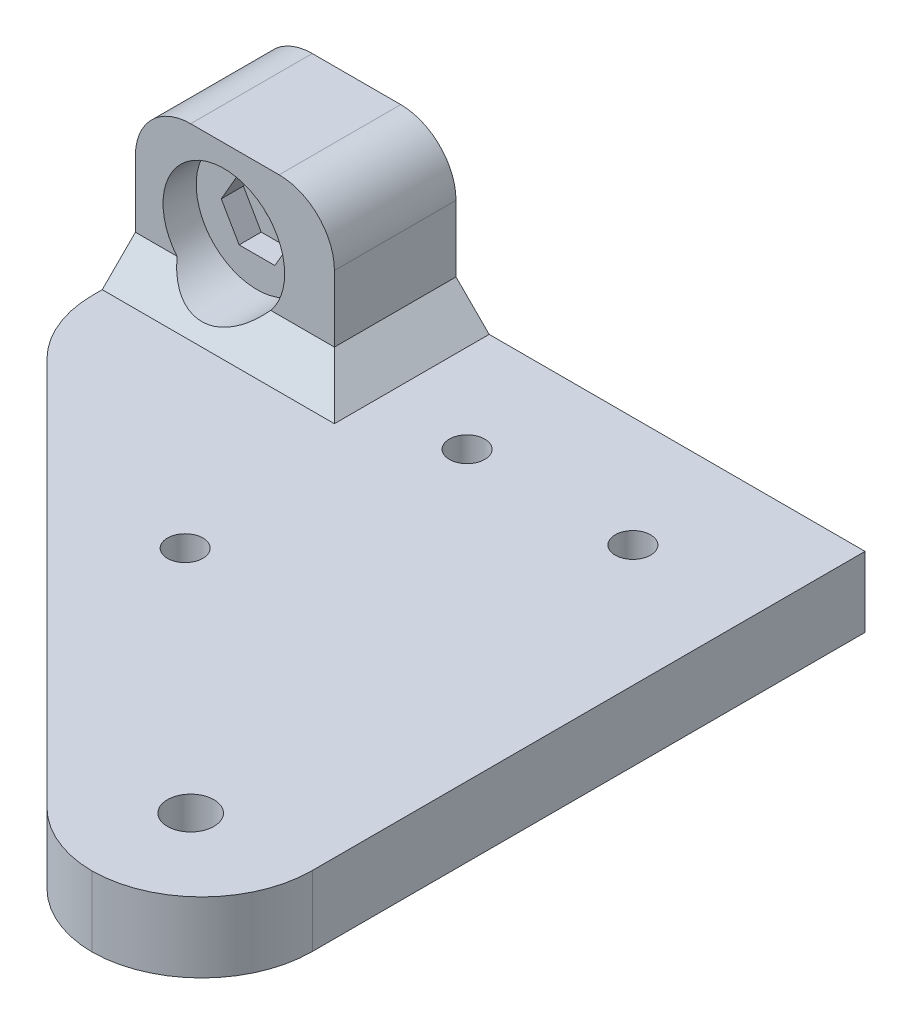
ISO-10303-21;
HEADER;
FILE_DESCRIPTION(('STEP AP214'),'2;1');
FILE_NAME('part.step','',(''),(''),'','','');
FILE_SCHEMA(('AUTOMOTIVE_DESIGN { 1 0 10303 214 1 1 1 1 }'));
ENDSEC;
DATA;
#1=APPLICATION_CONTEXT('core data for automotive mechanical design processes');
#2=APPLICATION_PROTOCOL_DEFINITION('international standard','automotive_design',2000,#1);
#3=PRODUCT_CONTEXT('',#1,'mechanical');
#4=PRODUCT('Part','Part','',(#3));
#5=PRODUCT_RELATED_PRODUCT_CATEGORY('part','',(#4));
#6=PRODUCT_DEFINITION_FORMATION('','',#4);
#7=PRODUCT_DEFINITION_CONTEXT('part definition',#1,'design');
#8=PRODUCT_DEFINITION('design','',#6,#7);
#9=PRODUCT_DEFINITION_SHAPE('','',#8);
#10=(LENGTH_UNIT() NAMED_UNIT(*) SI_UNIT(.MILLI.,.METRE.));
#11=(NAMED_UNIT(*) PLANE_ANGLE_UNIT() SI_UNIT($,.RADIAN.));
#12=(NAMED_UNIT(*) SI_UNIT($,.STERADIAN.) SOLID_ANGLE_UNIT());
#13=UNCERTAINTY_MEASURE_WITH_UNIT(LENGTH_MEASURE(1.E-05),#10,'distance_accuracy_value','');
#14=(GEOMETRIC_REPRESENTATION_CONTEXT(3) GLOBAL_UNCERTAINTY_ASSIGNED_CONTEXT((#13)) GLOBAL_UNIT_ASSIGNED_CONTEXT((#10,
#11,#12)) REPRESENTATION_CONTEXT('',''));
#15=CARTESIAN_POINT('',(0.,0.,0.));
#16=DIRECTION('',(0.,0.,1.));
#17=DIRECTION('',(1.,0.,0.));
#18=AXIS2_PLACEMENT_3D('',#15,#16,#17);
#19=CARTESIAN_POINT('',(-47.,-2623.18047378745,-60.));
#20=DIRECTION('',(0.,0.,1.));
#21=DIRECTION('',(1.,0.,0.));
#22=AXIS2_PLACEMENT_3D('',#19,#20,#21);
#23=CYLINDRICAL_SURFACE('',#22,1.59999999999963);
#24=CARTESIAN_POINT('',(-47.,-2623.18047378745,-54.));
#25=DIRECTION('',(0.,0.,1.));
#26=DIRECTION('',(1.,0.,0.));
#27=AXIS2_PLACEMENT_3D('',#24,#25,#26);
#28=CIRCLE('',#27,1.59999999999963);
#29=CARTESIAN_POINT('',(-45.4000000000004,-2623.18047378745,-54.));
#30=VERTEX_POINT('',#29);
#31=EDGE_CURVE('E203',#30,#30,#28,.T.);
#32=ORIENTED_EDGE('',*,*,#31,.T.);
#33=EDGE_LOOP('',(#32));
#34=FACE_BOUND('',#33,.T.);
#35=CARTESIAN_POINT('',(-47.,-2623.18047378745,-57.));
#36=DIRECTION('',(0.,0.,-1.));
#37=DIRECTION('',(-1.,0.,0.));
#38=AXIS2_PLACEMENT_3D('',#35,#36,#37);
#39=CIRCLE('',#38,1.59999999999963);
#40=CARTESIAN_POINT('',(-48.5999999999996,-2623.18047378745,-57.));
#41=VERTEX_POINT('',#40);
#42=EDGE_CURVE('E39',#41,#41,#39,.F.);
#43=ORIENTED_EDGE('',*,*,#42,.F.);
#44=EDGE_LOOP('',(#43));
#45=FACE_BOUND('',#44,.T.);
#46=ADVANCED_FACE('F35',(#34,#45),#23,.F.);
#47=CARTESIAN_POINT('',(0.,-2629.68047378745,0.));
#48=DIRECTION('',(0.,1.,0.));
#49=DIRECTION('',(0.,0.,1.));
#50=AXIS2_PLACEMENT_3D('',#47,#48,#49);
#51=PLANE('',#50);
#52=CARTESIAN_POINT('',(-26.,-2629.68047378745,-50.));
#53=DIRECTION('',(0.,1.,0.));
#54=DIRECTION('',(0.,0.,1.));
#55=AXIS2_PLACEMENT_3D('',#52,#53,#54);
#56=CIRCLE('',#55,1.59999999999996);
#57=CARTESIAN_POINT('',(-26.,-2629.68047378745,-48.4));
#58=VERTEX_POINT('',#57);
#59=EDGE_CURVE('E251',#58,#58,#56,.T.);
#60=ORIENTED_EDGE('',*,*,#59,.F.);
#61=EDGE_LOOP('',(#60));
#62=FACE_BOUND('',#61,.T.);
#63=CARTESIAN_POINT('',(-31.,-2629.68047378745,-29.5));
#64=DIRECTION('',(0.,1.,0.));
#65=DIRECTION('',(0.,0.,1.));
#66=AXIS2_PLACEMENT_3D('',#63,#64,#65);
#67=CIRCLE('',#66,1.59999999999996);
#68=CARTESIAN_POINT('',(-31.,-2629.68047378745,-27.9));
#69=VERTEX_POINT('',#68);
#70=EDGE_CURVE('E264',#69,#69,#67,.T.);
#71=ORIENTED_EDGE('',*,*,#70,.F.);
#72=EDGE_LOOP('',(#71));
#73=FACE_BOUND('',#72,.T.);
#74=CARTESIAN_POINT('',(-10.,-2629.68047378745,-9.));
#75=DIRECTION('',(0.,1.,0.));
#76=DIRECTION('',(0.,0.,1.));
#77=AXIS2_PLACEMENT_3D('',#74,#75,#76);
#78=CIRCLE('',#77,2.09999999999999);
#79=CARTESIAN_POINT('',(-10.,-2629.68047378745,-6.90000000000001));
#80=VERTEX_POINT('',#79);
#81=EDGE_CURVE('E270',#80,#80,#78,.T.);
#82=ORIENTED_EDGE('',*,*,#81,.F.);
#83=EDGE_LOOP('',(#82));
#84=FACE_BOUND('',#83,.T.);
#85=CARTESIAN_POINT('',(-11.,-2629.68047378745,-50.));
#86=DIRECTION('',(0.,1.,0.));
#87=DIRECTION('',(0.,0.,1.));
#88=AXIS2_PLACEMENT_3D('',#85,#86,#87);
#89=CIRCLE('',#88,1.59999999999996);
#90=CARTESIAN_POINT('',(-11.,-2629.68047378745,-48.4));
#91=VERTEX_POINT('',#90);
#92=EDGE_CURVE('E258',#91,#91,#89,.T.);
#93=ORIENTED_EDGE('',*,*,#92,.F.);
#94=EDGE_LOOP('',(#93));
#95=FACE_BOUND('',#94,.T.);
#96=DIRECTION('',(0.,0.,1.));
#97=VECTOR('',#96,1.);
#98=CARTESIAN_POINT('',(-55.,-2629.68047378745,-60.));
#99=LINE('',#98,#97);
#100=CARTESIAN_POINT('',(-55.,-2629.68047378745,-45.9999999999999));
#101=VERTEX_POINT('',#100);
#102=CARTESIAN_POINT('',(-55.,-2629.68047378745,-45.142135623731));
#103=VERTEX_POINT('',#102);
#104=EDGE_CURVE('E288',#101,#103,#99,.T.);
#105=ORIENTED_EDGE('',*,*,#104,.T.);
#106=CARTESIAN_POINT('',(-45.,-2629.68047378745,-45.142135623731));
#107=DIRECTION('',(0.,1.,0.));
#108=DIRECTION('',(0.,0.,1.));
#109=AXIS2_PLACEMENT_3D('',#106,#107,#108);
#110=CIRCLE('',#109,10.);
#111=CARTESIAN_POINT('',(-52.0710678118654,-2629.68047378745,-38.0710678118655));
#112=VERTEX_POINT('',#111);
#113=EDGE_CURVE('E333',#103,#112,#110,.T.);
#114=ORIENTED_EDGE('',*,*,#113,.T.);
#115=DIRECTION('',(0.707106781186552,0.,0.707106781186543));
#116=VECTOR('',#115,1.);
#117=CARTESIAN_POINT('',(-55.,-2629.68047378745,-41.));
#118=LINE('',#117,#116);
#119=CARTESIAN_POINT('',(-16.928932188134,-2629.68047378745,-2.92893218813449));
#120=VERTEX_POINT('',#119);
#121=EDGE_CURVE('E371',#112,#120,#118,.T.);
#122=ORIENTED_EDGE('',*,*,#121,.T.);
#123=CARTESIAN_POINT('',(-9.85786437626859,-2629.68047378745,-10.));
#124=DIRECTION('',(0.,1.,0.));
#125=DIRECTION('',(0.,0.,1.));
#126=AXIS2_PLACEMENT_3D('',#123,#124,#125);
#127=CIRCLE('',#126,10.);
#128=CARTESIAN_POINT('',(-9.9289321881343,-2629.68047378745,-0.000252534882861158));
#129=VERTEX_POINT('',#128);
#130=EDGE_CURVE('E364',#120,#129,#127,.T.);
#131=ORIENTED_EDGE('',*,*,#130,.T.);
#132=CARTESIAN_POINT('',(-10.,-2629.68047378745,-10.));
#133=DIRECTION('',(0.,1.,0.));
#134=DIRECTION('',(0.,0.,1.));
#135=AXIS2_PLACEMENT_3D('',#132,#133,#134);
#136=CIRCLE('',#135,10.);
#137=CARTESIAN_POINT('',(0.,-2629.68047378745,-10.));
#138=VERTEX_POINT('',#137);
#139=EDGE_CURVE('E362',#129,#138,#136,.T.);
#140=ORIENTED_EDGE('',*,*,#139,.T.);
#141=DIRECTION('',(0.,0.,-1.));
#142=VECTOR('',#141,1.);
#143=CARTESIAN_POINT('',(0.,-2629.68047378745,0.));
#144=LINE('',#143,#142);
#145=CARTESIAN_POINT('',(0.,-2629.68047378745,-60.));
#146=VERTEX_POINT('',#145);
#147=EDGE_CURVE('E276',#138,#146,#144,.T.);
#148=ORIENTED_EDGE('',*,*,#147,.T.);
#149=DIRECTION('',(-1.,0.,0.));
#150=VECTOR('',#149,1.);
#151=CARTESIAN_POINT('',(0.,-2629.68047378745,-60.));
#152=LINE('',#151,#150);
#153=CARTESIAN_POINT('',(-33.9999999999999,-2629.68047378745,-60.));
#154=VERTEX_POINT('',#153);
#155=EDGE_CURVE('E278',#146,#154,#152,.T.);
#156=ORIENTED_EDGE('',*,*,#155,.T.);
#157=DIRECTION('',(0.,0.,1.));
#158=VECTOR('',#157,1.);
#159=CARTESIAN_POINT('',(-33.9999999999999,-2629.68047378745,-49.));
#160=LINE('',#159,#158);
#161=CARTESIAN_POINT('',(-33.9999999999999,-2629.68047378745,-45.9999999999999));
#162=VERTEX_POINT('',#161);
#163=EDGE_CURVE('E404',#154,#162,#160,.T.);
#164=ORIENTED_EDGE('',*,*,#163,.T.);
#165=DIRECTION('',(-1.,0.,0.));
#166=VECTOR('',#165,1.);
#167=CARTESIAN_POINT('',(-55.,-2629.68047378745,-45.9999999999999));
#168=LINE('',#167,#166);
#169=EDGE_CURVE('E401',#162,#101,#168,.T.);
#170=ORIENTED_EDGE('',*,*,#169,.T.);
#171=EDGE_LOOP('',(#105,#114,#122,#131,#140,#148,#156,#164,#170));
#172=FACE_BOUND('',#171,.T.);
#173=ADVANCED_FACE('F370',(#62,#73,#84,#95,#172),#51,.T.);
#174=CARTESIAN_POINT('',(0.,-2636.03047378745,0.));
#175=DIRECTION('',(0.,1.,0.));
#176=DIRECTION('',(0.,0.,1.));
#177=AXIS2_PLACEMENT_3D('',#174,#175,#176);
#178=PLANE('',#177);
#179=CARTESIAN_POINT('',(-11.,-2636.03047378745,-50.));
#180=DIRECTION('',(0.,1.,0.));
#181=DIRECTION('',(0.,0.,1.));
#182=AXIS2_PLACEMENT_3D('',#179,#180,#181);
#183=CIRCLE('',#182,1.59999999999996);
#184=CARTESIAN_POINT('',(-11.,-2636.03047378745,-48.4));
#185=VERTEX_POINT('',#184);
#186=EDGE_CURVE('E254',#185,#185,#183,.T.);
#187=ORIENTED_EDGE('',*,*,#186,.T.);
#188=EDGE_LOOP('',(#187));
#189=FACE_BOUND('',#188,.T.);
#190=CARTESIAN_POINT('',(-10.,-2636.03047378745,-9.));
#191=DIRECTION('',(0.,1.,0.));
#192=DIRECTION('',(0.,0.,1.));
#193=AXIS2_PLACEMENT_3D('',#190,#191,#192);
#194=CIRCLE('',#193,2.09999999999999);
#195=CARTESIAN_POINT('',(-10.,-2636.03047378745,-6.90000000000001));
#196=VERTEX_POINT('',#195);
#197=EDGE_CURVE('E267',#196,#196,#194,.T.);
#198=ORIENTED_EDGE('',*,*,#197,.T.);
#199=EDGE_LOOP('',(#198));
#200=FACE_BOUND('',#199,.T.);
#201=DIRECTION('',(0.707106781186552,0.,0.707106781186543));
#202=VECTOR('',#201,1.);
#203=CARTESIAN_POINT('',(-55.,-2636.03047378745,-41.));
#204=LINE('',#203,#202);
#205=CARTESIAN_POINT('',(-52.0710678118654,-2636.03047378745,-38.0710678118655));
#206=VERTEX_POINT('',#205);
#207=CARTESIAN_POINT('',(-16.928932188134,-2636.03047378745,-2.92893218813449));
#208=VERTEX_POINT('',#207);
#209=EDGE_CURVE('E279',#206,#208,#204,.T.);
#210=ORIENTED_EDGE('',*,*,#209,.F.);
#211=CARTESIAN_POINT('',(-45.,-2636.03047378745,-45.142135623731));
#212=DIRECTION('',(0.,1.,0.));
#213=DIRECTION('',(0.,0.,1.));
#214=AXIS2_PLACEMENT_3D('',#211,#212,#213);
#215=CIRCLE('',#214,10.);
#216=CARTESIAN_POINT('',(-55.,-2636.03047378745,-45.142135623731));
#217=VERTEX_POINT('',#216);
#218=EDGE_CURVE('E354',#206,#217,#215,.F.);
#219=ORIENTED_EDGE('',*,*,#218,.T.);
#220=DIRECTION('',(0.,0.,1.));
#221=VECTOR('',#220,1.);
#222=CARTESIAN_POINT('',(-55.,-2636.03047378745,-60.));
#223=LINE('',#222,#221);
#224=CARTESIAN_POINT('',(-55.,-2636.03047378745,-60.));
#225=VERTEX_POINT('',#224);
#226=EDGE_CURVE('E389',#225,#217,#223,.T.);
#227=ORIENTED_EDGE('',*,*,#226,.F.);
#228=DIRECTION('',(-1.,0.,0.));
#229=VECTOR('',#228,1.);
#230=CARTESIAN_POINT('',(0.,-2636.03047378745,-60.));
#231=LINE('',#230,#229);
#232=CARTESIAN_POINT('',(0.,-2636.03047378745,-60.));
#233=VERTEX_POINT('',#232);
#234=EDGE_CURVE('E395',#233,#225,#231,.T.);
#235=ORIENTED_EDGE('',*,*,#234,.F.);
#236=DIRECTION('',(0.,0.,-1.));
#237=VECTOR('',#236,1.);
#238=CARTESIAN_POINT('',(0.,-2636.03047378745,0.));
#239=LINE('',#238,#237);
#240=CARTESIAN_POINT('',(0.,-2636.03047378745,-10.));
#241=VERTEX_POINT('',#240);
#242=EDGE_CURVE('E273',#241,#233,#239,.T.);
#243=ORIENTED_EDGE('',*,*,#242,.F.);
#244=CARTESIAN_POINT('',(-10.,-2636.03047378745,-10.));
#245=DIRECTION('',(0.,1.,0.));
#246=DIRECTION('',(0.,0.,1.));
#247=AXIS2_PLACEMENT_3D('',#244,#245,#246);
#248=CIRCLE('',#247,10.);
#249=CARTESIAN_POINT('',(-9.9289321881343,-2636.03047378745,-0.000252534882861158));
#250=VERTEX_POINT('',#249);
#251=EDGE_CURVE('E350',#241,#250,#248,.F.);
#252=ORIENTED_EDGE('',*,*,#251,.T.);
#253=CARTESIAN_POINT('',(-9.85786437626859,-2636.03047378745,-10.));
#254=DIRECTION('',(0.,1.,0.));
#255=DIRECTION('',(0.,0.,1.));
#256=AXIS2_PLACEMENT_3D('',#253,#254,#255);
#257=CIRCLE('',#256,10.);
#258=EDGE_CURVE('E352',#250,#208,#257,.F.);
#259=ORIENTED_EDGE('',*,*,#258,.T.);
#260=EDGE_LOOP('',(#210,#219,#227,#235,#243,#252,#259));
#261=FACE_BOUND('',#260,.T.);
#262=CARTESIAN_POINT('',(-31.,-2636.03047378745,-29.5));
#263=DIRECTION('',(0.,1.,0.));
#264=DIRECTION('',(0.,0.,1.));
#265=AXIS2_PLACEMENT_3D('',#262,#263,#264);
#266=CIRCLE('',#265,1.59999999999996);
#267=CARTESIAN_POINT('',(-31.,-2636.03047378745,-27.9));
#268=VERTEX_POINT('',#267);
#269=EDGE_CURVE('E261',#268,#268,#266,.T.);
#270=ORIENTED_EDGE('',*,*,#269,.T.);
#271=EDGE_LOOP('',(#270));
#272=FACE_BOUND('',#271,.T.);
#273=CARTESIAN_POINT('',(-26.,-2636.03047378745,-50.));
#274=DIRECTION('',(0.,1.,0.));
#275=DIRECTION('',(0.,0.,1.));
#276=AXIS2_PLACEMENT_3D('',#273,#274,#275);
#277=CIRCLE('',#276,1.59999999999996);
#278=CARTESIAN_POINT('',(-26.,-2636.03047378745,-48.4));
#279=VERTEX_POINT('',#278);
#280=EDGE_CURVE('E255',#279,#279,#277,.T.);
#281=ORIENTED_EDGE('',*,*,#280,.T.);
#282=EDGE_LOOP('',(#281));
#283=FACE_BOUND('',#282,.T.);
#284=ADVANCED_FACE('F386',(#189,#200,#261,#272,#283),#178,.F.);
#285=CARTESIAN_POINT('',(0.,-2629.68047378745,0.));
#286=DIRECTION('',(-1.,0.,0.));
#287=DIRECTION('',(0.,0.,1.));
#288=AXIS2_PLACEMENT_3D('',#285,#286,#287);
#289=PLANE('',#288);
#290=ORIENTED_EDGE('',*,*,#147,.F.);
#291=DIRECTION('',(0.,-1.,0.));
#292=VECTOR('',#291,1.);
#293=CARTESIAN_POINT('',(0.,-2629.68047378745,-10.));
#294=LINE('',#293,#292);
#295=EDGE_CURVE('E326',#138,#241,#294,.T.);
#296=ORIENTED_EDGE('',*,*,#295,.T.);
#297=ORIENTED_EDGE('',*,*,#242,.T.);
#298=DIRECTION('',(0.,-1.,0.));
#299=VECTOR('',#298,1.);
#300=CARTESIAN_POINT('',(0.,-2629.68047378745,-60.));
#301=LINE('',#300,#299);
#302=EDGE_CURVE('E289',#146,#233,#301,.T.);
#303=ORIENTED_EDGE('',*,*,#302,.F.);
#304=EDGE_LOOP('',(#290,#296,#297,#303));
#305=FACE_BOUND('',#304,.T.);
#306=ADVANCED_FACE('F430',(#305),#289,.F.);
#307=CARTESIAN_POINT('',(0.,-2629.68047378745,-60.));
#308=DIRECTION('',(0.,0.,1.));
#309=DIRECTION('',(1.,0.,0.));
#310=AXIS2_PLACEMENT_3D('',#307,#308,#309);
#311=PLANE('',#310);
#312=CARTESIAN_POINT('',(-47.,-2623.18047378745,-60.));
#313=DIRECTION('',(0.,0.,-1.));
#314=DIRECTION('',(-1.,0.,0.));
#315=AXIS2_PLACEMENT_3D('',#312,#313,#314);
#316=CIRCLE('',#315,2.94999999999941);
#317=CARTESIAN_POINT('',(-49.9499999999994,-2623.18047378745,-60.));
#318=VERTEX_POINT('',#317);
#319=EDGE_CURVE('E637',#318,#318,#316,.T.);
#320=ORIENTED_EDGE('',*,*,#319,.F.);
#321=EDGE_LOOP('',(#320));
#322=FACE_BOUND('',#321,.T.);
#323=DIRECTION('',(1.,0.,0.));
#324=VECTOR('',#323,1.);
#325=CARTESIAN_POINT('',(-55.,-2615.68047378745,-60.));
#326=LINE('',#325,#324);
#327=CARTESIAN_POINT('',(-50.,-2615.68047378745,-60.));
#328=VERTEX_POINT('',#327);
#329=CARTESIAN_POINT('',(-42.,-2615.68047378745,-60.));
#330=VERTEX_POINT('',#329);
#331=EDGE_CURVE('E237',#328,#330,#326,.T.);
#332=ORIENTED_EDGE('',*,*,#331,.T.);
#333=CARTESIAN_POINT('',(-42.,-2620.68047378745,-60.));
#334=DIRECTION('',(0.,0.,1.));
#335=DIRECTION('',(1.,0.,0.));
#336=AXIS2_PLACEMENT_3D('',#333,#334,#335);
#337=CIRCLE('',#336,5.);
#338=CARTESIAN_POINT('',(-37.,-2620.68047378745,-60.));
#339=VERTEX_POINT('',#338);
#340=EDGE_CURVE('E44',#330,#339,#337,.F.);
#341=ORIENTED_EDGE('',*,*,#340,.T.);
#342=DIRECTION('',(0.,-1.,0.));
#343=VECTOR('',#342,1.);
#344=CARTESIAN_POINT('',(-37.,-2615.68047378745,-60.));
#345=LINE('',#344,#343);
#346=CARTESIAN_POINT('',(-37.,-2626.68047378745,-60.));
#347=VERTEX_POINT('',#346);
#348=EDGE_CURVE('E247',#339,#347,#345,.T.);
#349=ORIENTED_EDGE('',*,*,#348,.T.);
#350=DIRECTION('',(-0.70710678118654,0.707106781186555,0.));
#351=VECTOR('',#350,1.);
#352=CARTESIAN_POINT('',(-17.0000000000003,-2646.68047378745,-60.));
#353=LINE('',#352,#351);
#354=EDGE_CURVE('E415',#347,#154,#353,.F.);
#355=ORIENTED_EDGE('',*,*,#354,.T.);
#356=ORIENTED_EDGE('',*,*,#155,.F.);
#357=ORIENTED_EDGE('',*,*,#302,.T.);
#358=ORIENTED_EDGE('',*,*,#234,.T.);
#359=DIRECTION('',(0.,-1.,0.));
#360=VECTOR('',#359,1.);
#361=CARTESIAN_POINT('',(-55.,-2629.68047378745,-60.));
#362=LINE('',#361,#360);
#363=CARTESIAN_POINT('',(-55.,-2620.68047378745,-60.));
#364=VERTEX_POINT('',#363);
#365=EDGE_CURVE('E381',#364,#225,#362,.T.);
#366=ORIENTED_EDGE('',*,*,#365,.F.);
#367=CARTESIAN_POINT('',(-50.,-2620.68047378745,-60.));
#368=DIRECTION('',(0.,0.,1.));
#369=DIRECTION('',(1.,0.,0.));
#370=AXIS2_PLACEMENT_3D('',#367,#368,#369);
#371=CIRCLE('',#370,5.);
#372=EDGE_CURVE('E59',#364,#328,#371,.F.);
#373=ORIENTED_EDGE('',*,*,#372,.T.);
#374=EDGE_LOOP('',(#332,#341,#349,#355,#356,#357,#358,#366,#373));
#375=FACE_BOUND('',#374,.T.);
#376=ADVANCED_FACE('F312',(#322,#375),#311,.F.);
#377=CARTESIAN_POINT('',(-55.,-2629.68047378745,-60.));
#378=DIRECTION('',(1.,0.,0.));
#379=DIRECTION('',(0.,0.,-1.));
#380=AXIS2_PLACEMENT_3D('',#377,#378,#379);
#381=PLANE('',#380);
#382=DIRECTION('',(0.,-1.,0.));
#383=VECTOR('',#382,1.);
#384=CARTESIAN_POINT('',(-55.,-2615.68047378745,-49.));
#385=LINE('',#384,#383);
#386=CARTESIAN_POINT('',(-55.,-2620.68047378745,-49.));
#387=VERTEX_POINT('',#386);
#388=CARTESIAN_POINT('',(-55.,-2626.68047378745,-49.));
#389=VERTEX_POINT('',#388);
#390=EDGE_CURVE('E250',#387,#389,#385,.T.);
#391=ORIENTED_EDGE('',*,*,#390,.F.);
#392=DIRECTION('',(0.,0.,-1.));
#393=VECTOR('',#392,1.);
#394=CARTESIAN_POINT('',(-55.,-2620.68047378745,-60.));
#395=LINE('',#394,#393);
#396=EDGE_CURVE('E11',#387,#364,#395,.T.);
#397=ORIENTED_EDGE('',*,*,#396,.T.);
#398=ORIENTED_EDGE('',*,*,#365,.T.);
#399=ORIENTED_EDGE('',*,*,#226,.T.);
#400=DIRECTION('',(0.,-1.,0.));
#401=VECTOR('',#400,1.);
#402=CARTESIAN_POINT('',(-55.,-2629.68047378745,-45.142135623731));
#403=LINE('',#402,#401);
#404=EDGE_CURVE('E327',#217,#103,#403,.F.);
#405=ORIENTED_EDGE('',*,*,#404,.T.);
#406=ORIENTED_EDGE('',*,*,#104,.F.);
#407=DIRECTION('',(0.,-0.707106781186555,0.70710678118654));
#408=VECTOR('',#407,1.);
#409=CARTESIAN_POINT('',(-55.,-2622.68047378745,-52.9999999999998));
#410=LINE('',#409,#408);
#411=EDGE_CURVE('E416',#101,#389,#410,.F.);
#412=ORIENTED_EDGE('',*,*,#411,.T.);
#413=EDGE_LOOP('',(#391,#397,#398,#399,#405,#406,#412));
#414=FACE_BOUND('',#413,.T.);
#415=ADVANCED_FACE('F392',(#414),#381,.F.);
#416=CARTESIAN_POINT('',(-55.,-2629.68047378745,-41.));
#417=DIRECTION('',(0.707106781186543,0.,-0.707106781186552));
#418=DIRECTION('',(-0.707106781186552,0.,-0.707106781186543));
#419=AXIS2_PLACEMENT_3D('',#416,#417,#418);
#420=PLANE('',#419);
#421=ORIENTED_EDGE('',*,*,#209,.T.);
#422=DIRECTION('',(0.,-1.,0.));
#423=VECTOR('',#422,1.);
#424=CARTESIAN_POINT('',(-16.928932188134,-2629.68047378745,-2.92893218813448));
#425=LINE('',#424,#423);
#426=EDGE_CURVE('E359',#208,#120,#425,.F.);
#427=ORIENTED_EDGE('',*,*,#426,.T.);
#428=ORIENTED_EDGE('',*,*,#121,.F.);
#429=DIRECTION('',(0.,-1.,0.));
#430=VECTOR('',#429,1.);
#431=CARTESIAN_POINT('',(-52.0710678118654,-2629.68047378745,-38.0710678118655));
#432=LINE('',#431,#430);
#433=EDGE_CURVE('E356',#112,#206,#432,.T.);
#434=ORIENTED_EDGE('',*,*,#433,.T.);
#435=EDGE_LOOP('',(#421,#427,#428,#434));
#436=FACE_BOUND('',#435,.T.);
#437=ADVANCED_FACE('F378',(#436),#420,.F.);
#438=CARTESIAN_POINT('',(-10.,-2629.68047378745,-9.));
#439=DIRECTION('',(0.,-1.,0.));
#440=DIRECTION('',(0.,0.,-1.));
#441=AXIS2_PLACEMENT_3D('',#438,#439,#440);
#442=CYLINDRICAL_SURFACE('',#441,2.09999999999999);
#443=ORIENTED_EDGE('',*,*,#81,.T.);
#444=EDGE_LOOP('',(#443));
#445=FACE_BOUND('',#444,.T.);
#446=ORIENTED_EDGE('',*,*,#197,.F.);
#447=EDGE_LOOP('',(#446));
#448=FACE_BOUND('',#447,.T.);
#449=ADVANCED_FACE('F502',(#445,#448),#442,.F.);
#450=CARTESIAN_POINT('',(-31.,-2629.68047378745,-29.5));
#451=DIRECTION('',(0.,-1.,0.));
#452=DIRECTION('',(0.,0.,-1.));
#453=AXIS2_PLACEMENT_3D('',#450,#451,#452);
#454=CYLINDRICAL_SURFACE('',#453,1.59999999999996);
#455=ORIENTED_EDGE('',*,*,#70,.T.);
#456=EDGE_LOOP('',(#455));
#457=FACE_BOUND('',#456,.T.);
#458=ORIENTED_EDGE('',*,*,#269,.F.);
#459=EDGE_LOOP('',(#458));
#460=FACE_BOUND('',#459,.T.);
#461=ADVANCED_FACE('F498',(#457,#460),#454,.F.);
#462=CARTESIAN_POINT('',(-11.,-2629.68047378745,-50.));
#463=DIRECTION('',(0.,-1.,0.));
#464=DIRECTION('',(0.,0.,-1.));
#465=AXIS2_PLACEMENT_3D('',#462,#463,#464);
#466=CYLINDRICAL_SURFACE('',#465,1.59999999999996);
#467=ORIENTED_EDGE('',*,*,#92,.T.);
#468=EDGE_LOOP('',(#467));
#469=FACE_BOUND('',#468,.T.);
#470=ORIENTED_EDGE('',*,*,#186,.F.);
#471=EDGE_LOOP('',(#470));
#472=FACE_BOUND('',#471,.T.);
#473=ADVANCED_FACE('F494',(#469,#472),#466,.F.);
#474=CARTESIAN_POINT('',(-26.,-2629.68047378745,-50.));
#475=DIRECTION('',(0.,-1.,0.));
#476=DIRECTION('',(0.,0.,-1.));
#477=AXIS2_PLACEMENT_3D('',#474,#475,#476);
#478=CYLINDRICAL_SURFACE('',#477,1.59999999999996);
#479=ORIENTED_EDGE('',*,*,#59,.T.);
#480=EDGE_LOOP('',(#479));
#481=FACE_BOUND('',#480,.T.);
#482=ORIENTED_EDGE('',*,*,#280,.F.);
#483=EDGE_LOOP('',(#482));
#484=FACE_BOUND('',#483,.T.);
#485=ADVANCED_FACE('F489',(#481,#484),#478,.F.);
#486=CARTESIAN_POINT('',(-55.,-2615.68047378745,-49.));
#487=DIRECTION('',(0.,0.,1.));
#488=DIRECTION('',(0.,-1.,0.));
#489=AXIS2_PLACEMENT_3D('',#486,#487,#488);
#490=PLANE('',#489);
#491=DIRECTION('',(0.,-1.,0.));
#492=VECTOR('',#491,1.);
#493=CARTESIAN_POINT('',(-37.,-2615.68047378745,-49.));
#494=LINE('',#493,#492);
#495=CARTESIAN_POINT('',(-37.,-2620.68047378745,-49.));
#496=VERTEX_POINT('',#495);
#497=CARTESIAN_POINT('',(-37.,-2626.68047378745,-49.));
#498=VERTEX_POINT('',#497);
#499=EDGE_CURVE('E248',#496,#498,#494,.T.);
#500=ORIENTED_EDGE('',*,*,#499,.F.);
#501=CARTESIAN_POINT('',(-42.,-2620.68047378745,-49.));
#502=DIRECTION('',(0.,0.,1.));
#503=DIRECTION('',(0.,-1.,0.));
#504=AXIS2_PLACEMENT_3D('',#501,#502,#503);
#505=CIRCLE('',#504,5.);
#506=CARTESIAN_POINT('',(-42.,-2615.68047378745,-49.));
#507=VERTEX_POINT('',#506);
#508=EDGE_CURVE('E302',#496,#507,#505,.T.);
#509=ORIENTED_EDGE('',*,*,#508,.T.);
#510=DIRECTION('',(-1.,0.,0.));
#511=VECTOR('',#510,1.);
#512=CARTESIAN_POINT('',(-55.,-2615.68047378745,-49.));
#513=LINE('',#512,#511);
#514=CARTESIAN_POINT('',(-50.,-2615.68047378745,-49.));
#515=VERTEX_POINT('',#514);
#516=EDGE_CURVE('E244',#507,#515,#513,.T.);
#517=ORIENTED_EDGE('',*,*,#516,.T.);
#518=CARTESIAN_POINT('',(-50.,-2620.68047378745,-49.));
#519=DIRECTION('',(0.,0.,1.));
#520=DIRECTION('',(0.,-1.,0.));
#521=AXIS2_PLACEMENT_3D('',#518,#519,#520);
#522=CIRCLE('',#521,5.);
#523=EDGE_CURVE('E300',#515,#387,#522,.T.);
#524=ORIENTED_EDGE('',*,*,#523,.T.);
#525=ORIENTED_EDGE('',*,*,#390,.T.);
#526=DIRECTION('',(1.,0.,0.));
#527=VECTOR('',#526,1.);
#528=CARTESIAN_POINT('',(-37.,-2626.68047378745,-49.));
#529=LINE('',#528,#527);
#530=CARTESIAN_POINT('',(-51.242640687119,-2626.68047378745,-49.));
#531=VERTEX_POINT('',#530);
#532=EDGE_CURVE('E413',#389,#531,#529,.T.);
#533=ORIENTED_EDGE('',*,*,#532,.T.);
#534=CARTESIAN_POINT('',(-47.,-2623.18047378745,-49.));
#535=DIRECTION('',(0.,0.,1.));
#536=DIRECTION('',(1.,0.,0.));
#537=AXIS2_PLACEMENT_3D('',#534,#535,#536);
#538=CIRCLE('',#537,5.49999999999966);
#539=CARTESIAN_POINT('',(-42.757359312881,-2626.68047378745,-49.));
#540=VERTEX_POINT('',#539);
#541=EDGE_CURVE('E238',#540,#531,#538,.T.);
#542=ORIENTED_EDGE('',*,*,#541,.F.);
#543=DIRECTION('',(1.,0.,0.));
#544=VECTOR('',#543,1.);
#545=CARTESIAN_POINT('',(-37.,-2626.68047378745,-49.));
#546=LINE('',#545,#544);
#547=EDGE_CURVE('E410',#540,#498,#546,.T.);
#548=ORIENTED_EDGE('',*,*,#547,.T.);
#549=EDGE_LOOP('',(#500,#509,#517,#524,#525,#533,#542,#548));
#550=FACE_BOUND('',#549,.T.);
#551=ADVANCED_FACE('F427',(#550),#490,.T.);
#552=CARTESIAN_POINT('',(-37.,-2615.68047378745,-60.));
#553=DIRECTION('',(1.,0.,0.));
#554=DIRECTION('',(0.,1.,0.));
#555=AXIS2_PLACEMENT_3D('',#552,#553,#554);
#556=PLANE('',#555);
#557=ORIENTED_EDGE('',*,*,#348,.F.);
#558=DIRECTION('',(0.,0.,1.));
#559=VECTOR('',#558,1.);
#560=CARTESIAN_POINT('',(-37.,-2620.68047378745,-60.));
#561=LINE('',#560,#559);
#562=EDGE_CURVE('E298',#339,#496,#561,.T.);
#563=ORIENTED_EDGE('',*,*,#562,.T.);
#564=ORIENTED_EDGE('',*,*,#499,.T.);
#565=DIRECTION('',(0.,0.,-1.));
#566=VECTOR('',#565,1.);
#567=CARTESIAN_POINT('',(-37.,-2626.68047378745,-60.));
#568=LINE('',#567,#566);
#569=EDGE_CURVE('E323',#498,#347,#568,.T.);
#570=ORIENTED_EDGE('',*,*,#569,.T.);
#571=EDGE_LOOP('',(#557,#563,#564,#570));
#572=FACE_BOUND('',#571,.T.);
#573=ADVANCED_FACE('F320',(#572),#556,.T.);
#574=CARTESIAN_POINT('',(0.,-2615.68047378745,0.));
#575=DIRECTION('',(0.,1.,0.));
#576=DIRECTION('',(0.,0.,1.));
#577=AXIS2_PLACEMENT_3D('',#574,#575,#576);
#578=PLANE('',#577);
#579=ORIENTED_EDGE('',*,*,#516,.F.);
#580=DIRECTION('',(0.,0.,1.));
#581=VECTOR('',#580,1.);
#582=CARTESIAN_POINT('',(-42.,-2615.68047378745,0.));
#583=LINE('',#582,#581);
#584=EDGE_CURVE('E306',#507,#330,#583,.F.);
#585=ORIENTED_EDGE('',*,*,#584,.T.);
#586=ORIENTED_EDGE('',*,*,#331,.F.);
#587=DIRECTION('',(0.,0.,-1.));
#588=VECTOR('',#587,1.);
#589=CARTESIAN_POINT('',(-50.,-2615.68047378745,-49.));
#590=LINE('',#589,#588);
#591=EDGE_CURVE('E304',#328,#515,#590,.F.);
#592=ORIENTED_EDGE('',*,*,#591,.T.);
#593=EDGE_LOOP('',(#579,#585,#586,#592));
#594=FACE_BOUND('',#593,.T.);
#595=ADVANCED_FACE('F434',(#594),#578,.T.);
#596=CARTESIAN_POINT('',(-47.,-2623.18047378745,-52.));
#597=DIRECTION('',(0.,0.,1.));
#598=DIRECTION('',(1.,0.,0.));
#599=AXIS2_PLACEMENT_3D('',#596,#597,#598);
#600=CYLINDRICAL_SURFACE('',#599,5.49999999999966);
#601=CARTESIAN_POINT('',(-47.,-2623.18047378745,-52.));
#602=DIRECTION('',(0.,0.,1.));
#603=DIRECTION('',(1.,0.,0.));
#604=AXIS2_PLACEMENT_3D('',#601,#602,#603);
#605=CIRCLE('',#604,5.49999999999966);
#606=CARTESIAN_POINT('',(-41.5000000000003,-2623.18047378745,-52.));
#607=VERTEX_POINT('',#606);
#608=EDGE_CURVE('E234',#607,#607,#605,.T.);
#609=ORIENTED_EDGE('',*,*,#608,.F.);
#610=EDGE_LOOP('',(#609));
#611=FACE_BOUND('',#610,.T.);
#612=ORIENTED_EDGE('',*,*,#541,.T.);
#613=CARTESIAN_POINT('',(-47.,-2623.18047378745,-52.4999999999998));
#614=DIRECTION('',(0.,0.70710678118654,0.707106781186555));
#615=DIRECTION('',(0.,-0.707106781186555,0.70710678118654));
#616=AXIS2_PLACEMENT_3D('',#613,#614,#615);
#617=ELLIPSE('',#616,7.77817459305146,5.49999999999966);
#618=EDGE_CURVE('E348',#531,#540,#617,.T.);
#619=ORIENTED_EDGE('',*,*,#618,.T.);
#620=EDGE_LOOP('',(#612,#619));
#621=FACE_BOUND('',#620,.T.);
#622=ADVANCED_FACE('F423',(#611,#621),#600,.F.);
#623=CARTESIAN_POINT('',(-47.,-2623.18047378745,-52.));
#624=DIRECTION('',(0.,0.,1.));
#625=DIRECTION('',(1.,0.,0.));
#626=AXIS2_PLACEMENT_3D('',#623,#624,#625);
#627=PLANE('',#626);
#628=DIRECTION('',(1.,0.,0.));
#629=VECTOR('',#628,1.);
#630=CARTESIAN_POINT('',(-48.6165807537305,-2625.98047378745,-52.));
#631=LINE('',#630,#629);
#632=CARTESIAN_POINT('',(-48.6165807537305,-2625.98047378745,-52.));
#633=VERTEX_POINT('',#632);
#634=CARTESIAN_POINT('',(-45.383419246269,-2625.98047378745,-52.));
#635=VERTEX_POINT('',#634);
#636=EDGE_CURVE('E51',#633,#635,#631,.T.);
#637=ORIENTED_EDGE('',*,*,#636,.F.);
#638=DIRECTION('',(0.500000000000025,-0.866025403784424,0.));
#639=VECTOR('',#638,1.);
#640=CARTESIAN_POINT('',(-50.2331615074617,-2623.18047378745,-52.));
#641=LINE('',#640,#639);
#642=CARTESIAN_POINT('',(-50.2331615074617,-2623.18047378745,-52.));
#643=VERTEX_POINT('',#642);
#644=EDGE_CURVE('E197',#643,#633,#641,.T.);
#645=ORIENTED_EDGE('',*,*,#644,.F.);
#646=DIRECTION('',(-0.49999999999998,-0.86602540378445,0.));
#647=VECTOR('',#646,1.);
#648=CARTESIAN_POINT('',(-48.6165807537307,-2620.38047378745,-52.));
#649=LINE('',#648,#647);
#650=CARTESIAN_POINT('',(-48.6165807537307,-2620.38047378745,-52.));
#651=VERTEX_POINT('',#650);
#652=EDGE_CURVE('E200',#651,#643,#649,.T.);
#653=ORIENTED_EDGE('',*,*,#652,.F.);
#654=DIRECTION('',(-1.,0.,0.));
#655=VECTOR('',#654,1.);
#656=CARTESIAN_POINT('',(-45.3834192462688,-2620.38047378745,-52.));
#657=LINE('',#656,#655);
#658=CARTESIAN_POINT('',(-45.3834192462688,-2620.38047378745,-52.));
#659=VERTEX_POINT('',#658);
#660=EDGE_CURVE('E219',#659,#651,#657,.T.);
#661=ORIENTED_EDGE('',*,*,#660,.F.);
#662=DIRECTION('',(-0.499999999999987,0.866025403784446,0.));
#663=VECTOR('',#662,1.);
#664=CARTESIAN_POINT('',(-43.7668384925379,-2623.18047378745,-52.));
#665=LINE('',#664,#663);
#666=CARTESIAN_POINT('',(-43.7668384925379,-2623.18047378745,-52.));
#667=VERTEX_POINT('',#666);
#668=EDGE_CURVE('E216',#667,#659,#665,.T.);
#669=ORIENTED_EDGE('',*,*,#668,.F.);
#670=DIRECTION('',(0.500000000000019,0.866025403784428,0.));
#671=VECTOR('',#670,1.);
#672=CARTESIAN_POINT('',(-45.383419246269,-2625.98047378745,-52.));
#673=LINE('',#672,#671);
#674=EDGE_CURVE('E214',#635,#667,#673,.T.);
#675=ORIENTED_EDGE('',*,*,#674,.F.);
#676=EDGE_LOOP('',(#637,#645,#653,#661,#669,#675));
#677=FACE_BOUND('',#676,.T.);
#678=ORIENTED_EDGE('',*,*,#608,.T.);
#679=EDGE_LOOP('',(#678));
#680=FACE_BOUND('',#679,.T.);
#681=ADVANCED_FACE('F478',(#677,#680),#627,.T.);
#682=CARTESIAN_POINT('',(0.,-2629.68047378745,-45.9999999999999));
#683=DIRECTION('',(0.,0.70710678118654,0.707106781186555));
#684=DIRECTION('',(1.,0.,0.));
#685=AXIS2_PLACEMENT_3D('',#682,#683,#684);
#686=PLANE('',#685);
#687=ORIENTED_EDGE('',*,*,#411,.F.);
#688=ORIENTED_EDGE('',*,*,#169,.F.);
#689=DIRECTION('',(-0.577350269189622,0.577350269189634,-0.577350269189622));
#690=VECTOR('',#689,1.);
#691=CARTESIAN_POINT('',(-22.6666666666668,-2641.01380712078,-34.6666666666668));
#692=LINE('',#691,#690);
#693=EDGE_CURVE('E241',#498,#162,#692,.F.);
#694=ORIENTED_EDGE('',*,*,#693,.F.);
#695=ORIENTED_EDGE('',*,*,#547,.F.);
#696=ORIENTED_EDGE('',*,*,#618,.F.);
#697=ORIENTED_EDGE('',*,*,#532,.F.);
#698=EDGE_LOOP('',(#687,#688,#694,#695,#696,#697));
#699=FACE_BOUND('',#698,.T.);
#700=ADVANCED_FACE('F428',(#699),#686,.T.);
#701=CARTESIAN_POINT('',(-33.9999999999999,-2629.68047378745,0.));
#702=DIRECTION('',(0.707106781186555,0.70710678118654,0.));
#703=DIRECTION('',(0.,0.,-1.));
#704=AXIS2_PLACEMENT_3D('',#701,#702,#703);
#705=PLANE('',#704);
#706=ORIENTED_EDGE('',*,*,#354,.F.);
#707=ORIENTED_EDGE('',*,*,#569,.F.);
#708=ORIENTED_EDGE('',*,*,#693,.T.);
#709=ORIENTED_EDGE('',*,*,#163,.F.);
#710=EDGE_LOOP('',(#706,#707,#708,#709));
#711=FACE_BOUND('',#710,.T.);
#712=ADVANCED_FACE('F429',(#711),#705,.T.);
#713=CARTESIAN_POINT('',(-10.,-2629.68047378745,-10.));
#714=DIRECTION('',(0.,-1.,0.));
#715=DIRECTION('',(0.,0.,-1.));
#716=AXIS2_PLACEMENT_3D('',#713,#714,#715);
#717=CYLINDRICAL_SURFACE('',#716,10.);
#718=ORIENTED_EDGE('',*,*,#295,.F.);
#719=ORIENTED_EDGE('',*,*,#139,.F.);
#720=DIRECTION('',(0.,-1.,0.));
#721=VECTOR('',#720,1.);
#722=CARTESIAN_POINT('',(-9.9289321881343,-2632.85547378745,-0.000252534882862893));
#723=LINE('',#722,#721);
#724=EDGE_CURVE('E226',#250,#129,#723,.F.);
#725=ORIENTED_EDGE('',*,*,#724,.F.);
#726=ORIENTED_EDGE('',*,*,#251,.F.);
#727=EDGE_LOOP('',(#718,#719,#725,#726));
#728=FACE_BOUND('',#727,.T.);
#729=ADVANCED_FACE('F521',(#728),#717,.T.);
#730=CARTESIAN_POINT('',(-9.85786437626859,-2629.68047378745,-10.));
#731=DIRECTION('',(0.,-1.,0.));
#732=DIRECTION('',(0.,0.,-1.));
#733=AXIS2_PLACEMENT_3D('',#730,#731,#732);
#734=CYLINDRICAL_SURFACE('',#733,10.);
#735=ORIENTED_EDGE('',*,*,#130,.F.);
#736=ORIENTED_EDGE('',*,*,#426,.F.);
#737=ORIENTED_EDGE('',*,*,#258,.F.);
#738=ORIENTED_EDGE('',*,*,#724,.T.);
#739=EDGE_LOOP('',(#735,#736,#737,#738));
#740=FACE_BOUND('',#739,.T.);
#741=ADVANCED_FACE('F524',(#740),#734,.T.);
#742=CARTESIAN_POINT('',(-45.,-2629.68047378745,-45.142135623731));
#743=DIRECTION('',(0.,-1.,0.));
#744=DIRECTION('',(0.,0.,-1.));
#745=AXIS2_PLACEMENT_3D('',#742,#743,#744);
#746=CYLINDRICAL_SURFACE('',#745,10.);
#747=ORIENTED_EDGE('',*,*,#113,.F.);
#748=ORIENTED_EDGE('',*,*,#404,.F.);
#749=ORIENTED_EDGE('',*,*,#218,.F.);
#750=ORIENTED_EDGE('',*,*,#433,.F.);
#751=EDGE_LOOP('',(#747,#748,#749,#750));
#752=FACE_BOUND('',#751,.T.);
#753=ADVANCED_FACE('F382',(#752),#746,.T.);
#754=CARTESIAN_POINT('',(-42.,-2620.68047378745,-60.));
#755=DIRECTION('',(0.,0.,1.));
#756=DIRECTION('',(1.,0.,0.));
#757=AXIS2_PLACEMENT_3D('',#754,#755,#756);
#758=CYLINDRICAL_SURFACE('',#757,5.);
#759=ORIENTED_EDGE('',*,*,#340,.F.);
#760=ORIENTED_EDGE('',*,*,#584,.F.);
#761=ORIENTED_EDGE('',*,*,#508,.F.);
#762=ORIENTED_EDGE('',*,*,#562,.F.);
#763=EDGE_LOOP('',(#759,#760,#761,#762));
#764=FACE_BOUND('',#763,.T.);
#765=ADVANCED_FACE('F325',(#764),#758,.T.);
#766=CARTESIAN_POINT('',(-50.,-2620.68047378745,-60.));
#767=DIRECTION('',(0.,0.,1.));
#768=DIRECTION('',(1.,0.,0.));
#769=AXIS2_PLACEMENT_3D('',#766,#767,#768);
#770=CYLINDRICAL_SURFACE('',#769,5.);
#771=ORIENTED_EDGE('',*,*,#523,.F.);
#772=ORIENTED_EDGE('',*,*,#591,.F.);
#773=ORIENTED_EDGE('',*,*,#372,.F.);
#774=ORIENTED_EDGE('',*,*,#396,.F.);
#775=EDGE_LOOP('',(#771,#772,#773,#774));
#776=FACE_BOUND('',#775,.T.);
#777=ADVANCED_FACE('F37',(#776),#770,.T.);
#778=CARTESIAN_POINT('',(-48.6165807537305,-2625.98047378745,-54.));
#779=DIRECTION('',(0.,-1.,0.));
#780=DIRECTION('',(0.,0.,-1.));
#781=AXIS2_PLACEMENT_3D('',#778,#779,#780);
#782=PLANE('',#781);
#783=ORIENTED_EDGE('',*,*,#636,.T.);
#784=DIRECTION('',(0.,0.,1.));
#785=VECTOR('',#784,1.);
#786=CARTESIAN_POINT('',(-45.383419246269,-2625.98047378745,-54.));
#787=LINE('',#786,#785);
#788=CARTESIAN_POINT('',(-45.383419246269,-2625.98047378745,-54.));
#789=VERTEX_POINT('',#788);
#790=EDGE_CURVE('E174',#789,#635,#787,.T.);
#791=ORIENTED_EDGE('',*,*,#790,.F.);
#792=DIRECTION('',(1.,0.,0.));
#793=VECTOR('',#792,1.);
#794=CARTESIAN_POINT('',(-48.6165807537305,-2625.98047378745,-54.));
#795=LINE('',#794,#793);
#796=CARTESIAN_POINT('',(-48.6165807537305,-2625.98047378745,-54.));
#797=VERTEX_POINT('',#796);
#798=EDGE_CURVE('E178',#797,#789,#795,.T.);
#799=ORIENTED_EDGE('',*,*,#798,.F.);
#800=DIRECTION('',(0.,0.,1.));
#801=VECTOR('',#800,1.);
#802=CARTESIAN_POINT('',(-48.6165807537305,-2625.98047378745,-54.));
#803=LINE('',#802,#801);
#804=EDGE_CURVE('E224',#797,#633,#803,.T.);
#805=ORIENTED_EDGE('',*,*,#804,.T.);
#806=EDGE_LOOP('',(#783,#791,#799,#805));
#807=FACE_BOUND('',#806,.T.);
#808=ADVANCED_FACE('F176',(#807),#782,.F.);
#809=CARTESIAN_POINT('',(-50.2331615074617,-2623.18047378745,-54.));
#810=DIRECTION('',(-0.866025403784424,-0.500000000000025,0.));
#811=DIRECTION('',(0.500000000000025,-0.866025403784424,0.));
#812=AXIS2_PLACEMENT_3D('',#809,#810,#811);
#813=PLANE('',#812);
#814=ORIENTED_EDGE('',*,*,#644,.T.);
#815=ORIENTED_EDGE('',*,*,#804,.F.);
#816=DIRECTION('',(0.500000000000025,-0.866025403784424,0.));
#817=VECTOR('',#816,1.);
#818=CARTESIAN_POINT('',(-50.2331615074617,-2623.18047378745,-54.));
#819=LINE('',#818,#817);
#820=CARTESIAN_POINT('',(-50.2331615074617,-2623.18047378745,-54.));
#821=VERTEX_POINT('',#820);
#822=EDGE_CURVE('E184',#821,#797,#819,.T.);
#823=ORIENTED_EDGE('',*,*,#822,.F.);
#824=DIRECTION('',(0.,0.,1.));
#825=VECTOR('',#824,1.);
#826=CARTESIAN_POINT('',(-50.2331615074617,-2623.18047378745,-54.));
#827=LINE('',#826,#825);
#828=EDGE_CURVE('E227',#821,#643,#827,.T.);
#829=ORIENTED_EDGE('',*,*,#828,.T.);
#830=EDGE_LOOP('',(#814,#815,#823,#829));
#831=FACE_BOUND('',#830,.T.);
#832=ADVANCED_FACE('F441',(#831),#813,.F.);
#833=CARTESIAN_POINT('',(-48.6165807537307,-2620.38047378745,-54.));
#834=DIRECTION('',(-0.86602540378445,0.49999999999998,0.));
#835=DIRECTION('',(-0.49999999999998,-0.86602540378445,0.));
#836=AXIS2_PLACEMENT_3D('',#833,#834,#835);
#837=PLANE('',#836);
#838=ORIENTED_EDGE('',*,*,#652,.T.);
#839=ORIENTED_EDGE('',*,*,#828,.F.);
#840=DIRECTION('',(-0.49999999999998,-0.86602540378445,0.));
#841=VECTOR('',#840,1.);
#842=CARTESIAN_POINT('',(-48.6165807537307,-2620.38047378745,-54.));
#843=LINE('',#842,#841);
#844=CARTESIAN_POINT('',(-48.6165807537307,-2620.38047378745,-54.));
#845=VERTEX_POINT('',#844);
#846=EDGE_CURVE('E210',#845,#821,#843,.T.);
#847=ORIENTED_EDGE('',*,*,#846,.F.);
#848=DIRECTION('',(0.,0.,1.));
#849=VECTOR('',#848,1.);
#850=CARTESIAN_POINT('',(-48.6165807537307,-2620.38047378745,-54.));
#851=LINE('',#850,#849);
#852=EDGE_CURVE('E229',#845,#651,#851,.T.);
#853=ORIENTED_EDGE('',*,*,#852,.T.);
#854=EDGE_LOOP('',(#838,#839,#847,#853));
#855=FACE_BOUND('',#854,.T.);
#856=ADVANCED_FACE('F463',(#855),#837,.F.);
#857=CARTESIAN_POINT('',(-45.3834192462688,-2620.38047378745,-54.));
#858=DIRECTION('',(0.,1.,0.));
#859=DIRECTION('',(0.,0.,1.));
#860=AXIS2_PLACEMENT_3D('',#857,#858,#859);
#861=PLANE('',#860);
#862=ORIENTED_EDGE('',*,*,#660,.T.);
#863=ORIENTED_EDGE('',*,*,#852,.F.);
#864=DIRECTION('',(-1.,0.,0.));
#865=VECTOR('',#864,1.);
#866=CARTESIAN_POINT('',(-45.3834192462688,-2620.38047378745,-54.));
#867=LINE('',#866,#865);
#868=CARTESIAN_POINT('',(-45.3834192462688,-2620.38047378745,-54.));
#869=VERTEX_POINT('',#868);
#870=EDGE_CURVE('E207',#869,#845,#867,.T.);
#871=ORIENTED_EDGE('',*,*,#870,.F.);
#872=DIRECTION('',(0.,0.,1.));
#873=VECTOR('',#872,1.);
#874=CARTESIAN_POINT('',(-45.3834192462688,-2620.38047378745,-54.));
#875=LINE('',#874,#873);
#876=EDGE_CURVE('E231',#869,#659,#875,.T.);
#877=ORIENTED_EDGE('',*,*,#876,.T.);
#878=EDGE_LOOP('',(#862,#863,#871,#877));
#879=FACE_BOUND('',#878,.T.);
#880=ADVANCED_FACE('F467',(#879),#861,.F.);
#881=CARTESIAN_POINT('',(-43.7668384925379,-2623.18047378745,-54.));
#882=DIRECTION('',(0.866025403784446,0.499999999999987,0.));
#883=DIRECTION('',(-0.499999999999987,0.866025403784446,0.));
#884=AXIS2_PLACEMENT_3D('',#881,#882,#883);
#885=PLANE('',#884);
#886=ORIENTED_EDGE('',*,*,#668,.T.);
#887=ORIENTED_EDGE('',*,*,#876,.F.);
#888=DIRECTION('',(-0.499999999999987,0.866025403784446,0.));
#889=VECTOR('',#888,1.);
#890=CARTESIAN_POINT('',(-43.7668384925379,-2623.18047378745,-54.));
#891=LINE('',#890,#889);
#892=CARTESIAN_POINT('',(-43.7668384925379,-2623.18047378745,-54.));
#893=VERTEX_POINT('',#892);
#894=EDGE_CURVE('E192',#893,#869,#891,.T.);
#895=ORIENTED_EDGE('',*,*,#894,.F.);
#896=DIRECTION('',(0.,0.,1.));
#897=VECTOR('',#896,1.);
#898=CARTESIAN_POINT('',(-43.7668384925379,-2623.18047378745,-54.));
#899=LINE('',#898,#897);
#900=EDGE_CURVE('E183',#893,#667,#899,.T.);
#901=ORIENTED_EDGE('',*,*,#900,.T.);
#902=EDGE_LOOP('',(#886,#887,#895,#901));
#903=FACE_BOUND('',#902,.T.);
#904=ADVANCED_FACE('F471',(#903),#885,.F.);
#905=CARTESIAN_POINT('',(-45.383419246269,-2625.98047378745,-54.));
#906=DIRECTION('',(0.866025403784428,-0.500000000000019,0.));
#907=DIRECTION('',(0.500000000000019,0.866025403784428,0.));
#908=AXIS2_PLACEMENT_3D('',#905,#906,#907);
#909=PLANE('',#908);
#910=ORIENTED_EDGE('',*,*,#674,.T.);
#911=ORIENTED_EDGE('',*,*,#900,.F.);
#912=DIRECTION('',(0.500000000000019,0.866025403784428,0.));
#913=VECTOR('',#912,1.);
#914=CARTESIAN_POINT('',(-45.383419246269,-2625.98047378745,-54.));
#915=LINE('',#914,#913);
#916=EDGE_CURVE('E187',#789,#893,#915,.T.);
#917=ORIENTED_EDGE('',*,*,#916,.F.);
#918=ORIENTED_EDGE('',*,*,#790,.T.);
#919=EDGE_LOOP('',(#910,#911,#917,#918));
#920=FACE_BOUND('',#919,.T.);
#921=ADVANCED_FACE('F188',(#920),#909,.F.);
#922=CARTESIAN_POINT('',(0.,0.,-54.));
#923=DIRECTION('',(0.,0.,1.));
#924=DIRECTION('',(1.,0.,0.));
#925=AXIS2_PLACEMENT_3D('',#922,#923,#924);
#926=PLANE('',#925);
#927=ORIENTED_EDGE('',*,*,#31,.F.);
#928=EDGE_LOOP('',(#927));
#929=FACE_BOUND('',#928,.T.);
#930=ORIENTED_EDGE('',*,*,#798,.T.);
#931=ORIENTED_EDGE('',*,*,#916,.T.);
#932=ORIENTED_EDGE('',*,*,#894,.T.);
#933=ORIENTED_EDGE('',*,*,#870,.T.);
#934=ORIENTED_EDGE('',*,*,#846,.T.);
#935=ORIENTED_EDGE('',*,*,#822,.T.);
#936=EDGE_LOOP('',(#930,#931,#932,#933,#934,#935));
#937=FACE_BOUND('',#936,.T.);
#938=ADVANCED_FACE('F194',(#929,#937),#926,.T.);
#939=CARTESIAN_POINT('',(-47.,-2623.18047378745,-57.));
#940=DIRECTION('',(0.,0.,-1.));
#941=DIRECTION('',(-1.,0.,0.));
#942=AXIS2_PLACEMENT_3D('',#939,#940,#941);
#943=PLANE('',#942);
#944=CARTESIAN_POINT('',(-47.,-2623.18047378745,-57.));
#945=DIRECTION('',(0.,0.,-1.));
#946=DIRECTION('',(-1.,0.,0.));
#947=AXIS2_PLACEMENT_3D('',#944,#945,#946);
#948=CIRCLE('',#947,2.94999999999941);
#949=CARTESIAN_POINT('',(-49.9499999999994,-2623.18047378745,-57.));
#950=VERTEX_POINT('',#949);
#951=EDGE_CURVE('E634',#950,#950,#948,.T.);
#952=ORIENTED_EDGE('',*,*,#951,.T.);
#953=EDGE_LOOP('',(#952));
#954=FACE_BOUND('',#953,.T.);
#955=ORIENTED_EDGE('',*,*,#42,.T.);
#956=EDGE_LOOP('',(#955));
#957=FACE_BOUND('',#956,.T.);
#958=ADVANCED_FACE('F459',(#954,#957),#943,.T.);
#959=CARTESIAN_POINT('',(-47.,-2623.18047378745,-57.));
#960=DIRECTION('',(0.,0.,-1.));
#961=DIRECTION('',(-1.,0.,0.));
#962=AXIS2_PLACEMENT_3D('',#959,#960,#961);
#963=CYLINDRICAL_SURFACE('',#962,2.94999999999941);
#964=ORIENTED_EDGE('',*,*,#951,.F.);
#965=EDGE_LOOP('',(#964));
#966=FACE_BOUND('',#965,.T.);
#967=ORIENTED_EDGE('',*,*,#319,.T.);
#968=EDGE_LOOP('',(#967));
#969=FACE_BOUND('',#968,.T.);
#970=ADVANCED_FACE('F455',(#966,#969),#963,.F.);
#971=CLOSED_SHELL('',(#46,#173,#284,#306,#376,#415,#437,#449,#461,#473,#485,#551,#573,#595,#622,
#681,#700,#712,#729,#741,#753,#765,#777,#808,#832,#856,#880,#904,#921,#938,#958,#970));
#972=MANIFOLD_SOLID_BREP('B2',#971);
#973=ADVANCED_BREP_SHAPE_REPRESENTATION('',(#18,#972),#14);
#974=SHAPE_DEFINITION_REPRESENTATION(#9,#973);
ENDSEC;
END-ISO-10303-21;
